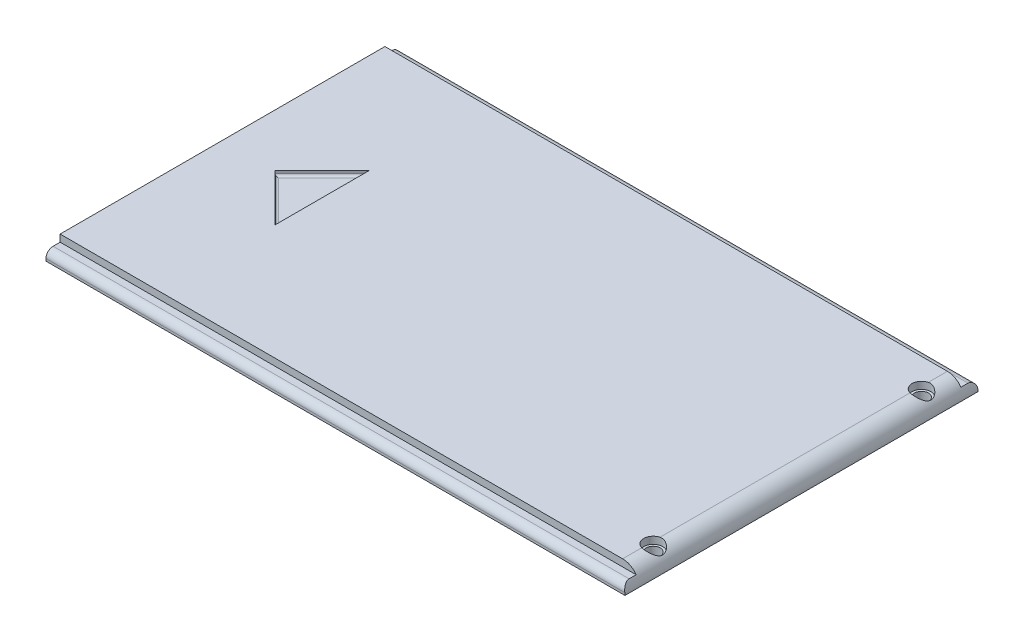
ISO-10303-21;
HEADER;
FILE_DESCRIPTION(('STEP AP214'),'2;1');
FILE_NAME('part.step','',(''),(''),'','','');
FILE_SCHEMA(('AUTOMOTIVE_DESIGN { 1 0 10303 214 1 1 1 1 }'));
ENDSEC;
DATA;
#1=APPLICATION_CONTEXT('core data for automotive mechanical design processes');
#2=APPLICATION_PROTOCOL_DEFINITION('international standard','automotive_design',2000,#1);
#3=PRODUCT_CONTEXT('',#1,'mechanical');
#4=PRODUCT('Part','Part','',(#3));
#5=PRODUCT_RELATED_PRODUCT_CATEGORY('part','',(#4));
#6=PRODUCT_DEFINITION_FORMATION('','',#4);
#7=PRODUCT_DEFINITION_CONTEXT('part definition',#1,'design');
#8=PRODUCT_DEFINITION('design','',#6,#7);
#9=PRODUCT_DEFINITION_SHAPE('','',#8);
#10=(LENGTH_UNIT() NAMED_UNIT(*) SI_UNIT(.MILLI.,.METRE.));
#11=(NAMED_UNIT(*) PLANE_ANGLE_UNIT() SI_UNIT($,.RADIAN.));
#12=(NAMED_UNIT(*) SI_UNIT($,.STERADIAN.) SOLID_ANGLE_UNIT());
#13=UNCERTAINTY_MEASURE_WITH_UNIT(LENGTH_MEASURE(1.E-05),#10,'distance_accuracy_value','');
#14=(GEOMETRIC_REPRESENTATION_CONTEXT(3) GLOBAL_UNCERTAINTY_ASSIGNED_CONTEXT((#13)) GLOBAL_UNIT_ASSIGNED_CONTEXT((#10,
#11,#12)) REPRESENTATION_CONTEXT('',''));
#15=CARTESIAN_POINT('',(0.,0.,0.));
#16=DIRECTION('',(0.,0.,1.));
#17=DIRECTION('',(1.,0.,0.));
#18=AXIS2_PLACEMENT_3D('',#15,#16,#17);
#19=CARTESIAN_POINT('',(64.50000001,-3.49999999,-37.5));
#20=DIRECTION('',(0.,0.,1.));
#21=DIRECTION('',(1.,0.,0.));
#22=AXIS2_PLACEMENT_3D('',#19,#20,#21);
#23=CYLINDRICAL_SURFACE('',#22,3.49999999);
#24=CARTESIAN_POINT('',(64.50000001,0.,30.4364916756857));
#25=CARTESIAN_POINT('',(64.5489479587532,8.99946474155549E-06,30.4491388532927));
#26=CARTESIAN_POINT('',(64.598379134142,-0.00102660867594324,30.4599135039343));
#27=CARTESIAN_POINT('',(64.6978167519258,-0.00524276917827934,30.4776821803047));
#28=CARTESIAN_POINT('',(64.7478230890506,-0.00842293497986771,30.4846768869653));
#29=CARTESIAN_POINT('',(64.8478154710043,-0.0169649068301376,30.4948321111438));
#30=CARTESIAN_POINT('',(64.8978006217056,-0.0223169719444363,30.498009500504));
#31=CARTESIAN_POINT('',(64.9975757498518,-0.0351833927190662,30.5006220024395));
#32=CARTESIAN_POINT('',(65.047365729486,-0.0426977240540573,30.5000571571131));
#33=CARTESIAN_POINT('',(65.1958748776527,-0.0684106047319932,30.492843890949));
#34=CARTESIAN_POINT('',(65.2938436313978,-0.0897884925022422,30.4806875611345));
#35=CARTESIAN_POINT('',(65.4850667284782,-0.140021107673576,30.442741894867));
#36=CARTESIAN_POINT('',(65.5783175771463,-0.168881283216222,30.4169426101623));
#37=CARTESIAN_POINT('',(65.7624589718375,-0.234090289111973,30.3516562499357));
#38=CARTESIAN_POINT('',(65.8530436176814,-0.27072253275191,30.311594119605));
#39=CARTESIAN_POINT('',(66.0258161552739,-0.34866883436279,30.2196784519949));
#40=CARTESIAN_POINT('',(66.1079986829417,-0.389985848127349,30.1678174493731));
#41=CARTESIAN_POINT('',(66.2755382638665,-0.48205578852724,30.0445008606348));
#42=CARTESIAN_POINT('',(66.3593168316978,-0.533263588531057,29.9712400835719));
#43=CARTESIAN_POINT('',(66.5136863511132,-0.635797683211848,29.811897125878));
#44=CARTESIAN_POINT('',(66.5842684723606,-0.687124034131373,29.7258064289061));
#45=CARTESIAN_POINT('',(66.704399132893,-0.780480331513154,29.5512098969664));
#46=CARTESIAN_POINT('',(66.7553795371559,-0.822920163852898,29.4639117918178));
#47=CARTESIAN_POINT('',(66.8444435150821,-0.900563181900162,29.2800131277751));
#48=CARTESIAN_POINT('',(66.8825507895468,-0.935779619147972,29.1834300894273));
#49=CARTESIAN_POINT('',(66.9368115889876,-0.987426766141093,29.0052914958963));
#50=CARTESIAN_POINT('',(66.9559982862572,-1.00631505933346,28.9253867690809));
#51=CARTESIAN_POINT('',(66.9844558796739,-1.03466157744723,28.7622330583456));
#52=CARTESIAN_POINT('',(66.9937411214326,-1.04413344389968,28.6789890945142));
#53=CARTESIAN_POINT('',(67.0017392496257,-1.05227847842123,28.5111073617221));
#54=CARTESIAN_POINT('',(67.000410096247,-1.05090870683998,28.4264653767825));
#55=CARTESIAN_POINT('',(66.9871925961815,-1.03749079231264,28.2588525666932));
#56=CARTESIAN_POINT('',(66.9752946032246,-1.02543289424369,28.1758833390492));
#57=CARTESIAN_POINT('',(66.9388159373426,-0.989436114341144,27.9995233220653));
#58=CARTESIAN_POINT('',(66.912365667948,-0.963774294191114,27.9068817081233));
#59=CARTESIAN_POINT('',(66.8477460989433,-0.903844576590191,27.7287284435997));
#60=CARTESIAN_POINT('',(66.8095524920008,-0.869558855709185,27.6432320540465));
#61=CARTESIAN_POINT('',(66.7092078774201,-0.784310374058825,27.4543550360266));
#62=CARTESIAN_POINT('',(66.6433000215003,-0.731494885936917,27.3538135636222));
#63=CARTESIAN_POINT('',(66.4955957207993,-0.623193590175312,27.166804750737));
#64=CARTESIAN_POINT('',(66.4137825505568,-0.567705018226645,27.0803524033506));
#65=CARTESIAN_POINT('',(66.2343509596974,-0.458090126062468,26.9217498933621));
#66=CARTESIAN_POINT('',(66.1365587851602,-0.403987346132609,26.8497789382701));
#67=CARTESIAN_POINT('',(65.9272118074362,-0.302102099808841,26.7237285203503));
#68=CARTESIAN_POINT('',(65.8156825209744,-0.254308246857113,26.6696165525979));
#69=CARTESIAN_POINT('',(65.6051824755106,-0.177583235053472,26.591159969809));
#70=CARTESIAN_POINT('',(65.5083098422401,-0.146793451130596,26.5629904081305));
#71=CARTESIAN_POINT('',(65.3092816539485,-0.0932981647452588,26.5214580014706));
#72=CARTESIAN_POINT('',(65.2071329242709,-0.0705825031444176,26.5080765045795));
#73=CARTESIAN_POINT('',(65.05378463043,-0.0437112266429289,26.5000908595401));
#74=CARTESIAN_POINT('',(65.0034410494837,-0.036022163592896,26.4993652628434));
#75=CARTESIAN_POINT('',(64.9025414196589,-0.02285431065166,26.5017398017844));
#76=CARTESIAN_POINT('',(64.8519853755725,-0.017375471175771,26.5048398515903));
#77=CARTESIAN_POINT('',(64.7508167322537,-0.00862784947519592,26.5149297670375));
#78=CARTESIAN_POINT('',(64.7002051126762,-0.00537024708748225,26.5219389916141));
#79=CARTESIAN_POINT('',(64.5995639613606,-0.00105137541180415,26.5398283267594));
#80=CARTESIAN_POINT('',(64.5495345624004,9.40227629696295E-06,26.5507093031006));
#81=CARTESIAN_POINT('',(64.50000001,0.,26.5635083243143));
#82=B_SPLINE_CURVE_WITH_KNOTS('',3,(#24,#25,#26,#27,#28,#29,#30,#31,#32,#33,#34,#35,#36,#37,#38,
#39,#40,#41,#42,#43,#44,#45,#46,#47,#48,#49,#50,#51,#52,#53,#54,#55,#56,#57,#58,#59,#60,#61,#62,
#63,#64,#65,#66,#67,#68,#69,#70,#71,#72,#73,#74,#75,#76,#77,#78,#79,#80,#81),.UNSPECIFIED.,.F.,
.F.,(4,2,2,2,2,2,2,2,2,2,2,2,2,2,2,2,2,2,2,2,2,2,2,2,2,2,2,2,4),(0.,0.151617585968135,
0.303207849918215,0.454125618392376,0.605041689118829,0.906544253342981,1.208266972787,
1.5238691431349,1.83967155830797,2.20576322191464,2.57209898400174,2.89988037826912,
3.227054960522,3.47900268804841,3.7305848859297,3.98316400340511,4.23597388913533,
4.53345697081039,4.8315600007783,5.22347686673843,5.61580810972407,6.01273052912397,
6.40892647878417,6.72407445087522,7.03882447744424,7.19146428222397,7.34410066245524,
7.49749972450405,7.65093311009855),.UNSPECIFIED.);
#83=CARTESIAN_POINT('',(64.50000001,0.,30.4364916756857));
#84=VERTEX_POINT('',#83);
#85=CARTESIAN_POINT('',(64.50000001,0.,26.5635083243143));
#86=VERTEX_POINT('',#85);
#87=EDGE_CURVE('E63',#84,#86,#82,.T.);
#88=ORIENTED_EDGE('',*,*,#87,.F.);
#89=DIRECTION('',(0.,0.,1.));
#90=VECTOR('',#89,1.);
#91=CARTESIAN_POINT('',(64.50000001,0.,0.));
#92=LINE('',#91,#90);
#93=CARTESIAN_POINT('',(64.50000001,0.,34.5));
#94=VERTEX_POINT('',#93);
#95=EDGE_CURVE('E176',#94,#84,#92,.F.);
#96=ORIENTED_EDGE('',*,*,#95,.F.);
#97=CARTESIAN_POINT('',(64.50000001,-3.49999999,34.5));
#98=DIRECTION('',(0.,0.,-1.));
#99=DIRECTION('',(-1.,0.,0.));
#100=AXIS2_PLACEMENT_3D('',#97,#98,#99);
#101=CIRCLE('',#100,3.49999999);
#102=CARTESIAN_POINT('',(67.3722813280467,-1.5,34.5));
#103=VERTEX_POINT('',#102);
#104=EDGE_CURVE('E181',#103,#94,#101,.F.);
#105=ORIENTED_EDGE('',*,*,#104,.F.);
#106=DIRECTION('',(0.,0.,1.));
#107=VECTOR('',#106,1.);
#108=CARTESIAN_POINT('',(67.3722813280467,-1.5,-37.5));
#109=LINE('',#108,#107);
#110=CARTESIAN_POINT('',(67.3722813280467,-1.5,36.));
#111=VERTEX_POINT('',#110);
#112=EDGE_CURVE('E328',#111,#103,#109,.F.);
#113=ORIENTED_EDGE('',*,*,#112,.F.);
#114=CARTESIAN_POINT('',(67.9641016164775,-3.,37.5));
#115=CARTESIAN_POINT('',(67.958056898597,-2.95809108313595,37.5000016562439));
#116=CARTESIAN_POINT('',(67.9512461853046,-2.91631921427232,37.4982428215695));
#117=CARTESIAN_POINT('',(67.9361821462669,-2.83334841832102,37.4912945517625));
#118=CARTESIAN_POINT('',(67.9279296528039,-2.79214917541149,37.4861070910567));
#119=CARTESIAN_POINT('',(67.9012324336867,-2.6702462904303,37.4656114921474));
#120=CARTESIAN_POINT('',(67.8807777568639,-2.59075851493561,37.4453679281022));
#121=CARTESIAN_POINT('',(67.8357522205007,-2.43738320617385,37.3928518395272));
#122=CARTESIAN_POINT('',(67.8111891992998,-2.36348539047602,37.3606020807296));
#123=CARTESIAN_POINT('',(67.7593563436892,-2.22240372235505,37.2852041133876));
#124=CARTESIAN_POINT('',(67.7320828798125,-2.15522912092652,37.2420411686738));
#125=CARTESIAN_POINT('',(67.6743936200363,-2.02393997257897,37.1422013803958));
#126=CARTESIAN_POINT('',(67.6438972838747,-1.96045569503672,37.084741746487));
#127=CARTESIAN_POINT('',(67.5840689082067,-1.84385389210013,36.9595047189957));
#128=CARTESIAN_POINT('',(67.5547376723847,-1.79074342691032,36.8917203540695));
#129=CARTESIAN_POINT('',(67.4988668899811,-1.69444839749928,36.7440522124822));
#130=CARTESIAN_POINT('',(67.4724833891901,-1.65173879962502,36.663796256405));
#131=CARTESIAN_POINT('',(67.4274148160973,-1.58114013996386,36.4951003823062));
#132=CARTESIAN_POINT('',(67.4087053801203,-1.5532040919889,36.4066874734797));
#133=CARTESIAN_POINT('',(67.3896524404958,-1.52515709307117,36.2765247768066));
#134=CARTESIAN_POINT('',(67.3849122713869,-1.51825306902602,36.2367771382134));
#135=CARTESIAN_POINT('',(67.3776047737033,-1.5076561641128,36.1566489817442));
#136=CARTESIAN_POINT('',(67.375037087309,-1.50396275443664,36.1162685692057));
#137=CARTESIAN_POINT('',(67.3721768855699,-1.49984759518409,36.0348859876478));
#138=CARTESIAN_POINT('',(67.371905761339,-1.49945660578885,35.9938815293493));
#139=CARTESIAN_POINT('',(67.3736848746566,-1.50202012500044,35.9120003721922));
#140=CARTESIAN_POINT('',(67.3757366670591,-1.50497687443005,35.8711237772936));
#141=CARTESIAN_POINT('',(67.3789451711659,-1.50960437882137,35.8305276058718));
#142=B_SPLINE_CURVE_WITH_KNOTS('',3,(#114,#115,#116,#117,#118,#119,#120,#121,#122,#123,#124,
#125,#126,#127,#128,#129,#130,#131,#132,#133,#134,#135,#136,#137,#138,#139,#140,#141),
.UNSPECIFIED.,.F.,.F.,(4,2,2,2,2,2,2,2,2,2,2,2,2,4),(0.,0.126935715191683,0.253798396121726,
0.506091616300996,0.757908863356798,1.01006797454409,1.28157490359765,1.55326597574902,
1.83568937731862,2.11720906634849,2.23891631717456,2.36060351826163,2.48342293122763,
2.60632460249966),.UNSPECIFIED.);
#143=CARTESIAN_POINT('',(67.9641016164775,-3.,37.5));
#144=VERTEX_POINT('',#143);
#145=EDGE_CURVE('E214',#144,#111,#142,.T.);
#146=ORIENTED_EDGE('',*,*,#145,.F.);
#147=CARTESIAN_POINT('',(64.50000001,-3.49999999,37.5));
#148=DIRECTION('',(0.,0.,1.));
#149=DIRECTION('',(1.,0.,0.));
#150=AXIS2_PLACEMENT_3D('',#147,#148,#149);
#151=CIRCLE('',#150,3.49999999);
#152=CARTESIAN_POINT('',(68.,-3.5,37.5));
#153=VERTEX_POINT('',#152);
#154=EDGE_CURVE('E324',#153,#144,#151,.T.);
#155=ORIENTED_EDGE('',*,*,#154,.F.);
#156=DIRECTION('',(0.,0.,-1.));
#157=VECTOR('',#156,1.);
#158=CARTESIAN_POINT('',(68.,-3.5,-37.5));
#159=LINE('',#158,#157);
#160=CARTESIAN_POINT('',(68.,-3.5,-37.5));
#161=VERTEX_POINT('',#160);
#162=EDGE_CURVE('E366',#153,#161,#159,.T.);
#163=ORIENTED_EDGE('',*,*,#162,.T.);
#164=CARTESIAN_POINT('',(64.50000001,-3.49999999,-37.5));
#165=DIRECTION('',(0.,0.,-1.));
#166=DIRECTION('',(-1.,0.,0.));
#167=AXIS2_PLACEMENT_3D('',#164,#165,#166);
#168=CIRCLE('',#167,3.49999999);
#169=CARTESIAN_POINT('',(67.9641016164775,-3.,-37.5));
#170=VERTEX_POINT('',#169);
#171=EDGE_CURVE('E202',#170,#161,#168,.T.);
#172=ORIENTED_EDGE('',*,*,#171,.F.);
#173=CARTESIAN_POINT('',(67.3722813280467,-1.5,-36.));
#174=CARTESIAN_POINT('',(67.3722733039118,-1.49999626556642,-36.0380156616939));
#175=CARTESIAN_POINT('',(67.3732887534835,-1.5014461768493,-36.0760086821842));
#176=CARTESIAN_POINT('',(67.3772874676731,-1.50720402057786,-36.1516453567383));
#177=CARTESIAN_POINT('',(67.3802692551257,-1.51150980762779,-36.1892892515647));
#178=CARTESIAN_POINT('',(67.3919864263606,-1.52855098704535,-36.3007421376261));
#179=CARTESIAN_POINT('',(67.4034961779184,-1.54541199213621,-36.3736763704343));
#180=CARTESIAN_POINT('',(67.4324904153631,-1.58919531576038,-36.5148756346789));
#181=CARTESIAN_POINT('',(67.4499592261555,-1.6160912549799,-36.583152357766));
#182=CARTESIAN_POINT('',(67.489162834911,-1.67893516282104,-36.714197995986));
#183=CARTESIAN_POINT('',(67.5109054964191,-1.71489985224839,-36.7769564451374));
#184=CARTESIAN_POINT('',(67.5592426880696,-1.79893867661959,-36.9020473801628));
#185=CARTESIAN_POINT('',(67.586105333043,-1.84786766604753,-36.9637002131724));
#186=CARTESIAN_POINT('',(67.6408462014888,-1.9544652647839,-37.0784210994685));
#187=CARTESIAN_POINT('',(67.6687249350644,-2.01213831105433,-37.1314847659625));
#188=CARTESIAN_POINT('',(67.7272676525446,-2.14333087993751,-37.2344845173913));
#189=CARTESIAN_POINT('',(67.7578205252307,-2.21793614665789,-37.2831095042347));
#190=CARTESIAN_POINT('',(67.8155270933459,-2.37559315090751,-37.3667660070858));
#191=CARTESIAN_POINT('',(67.8426849020325,-2.45863444223871,-37.4018140823224));
#192=CARTESIAN_POINT('',(67.8789851202846,-2.58656545593647,-37.4425679379369));
#193=CARTESIAN_POINT('',(67.8902046145112,-2.62908852817546,-37.4540907878974));
#194=CARTESIAN_POINT('',(67.9111964493971,-2.715331927503,-37.473402245736));
#195=CARTESIAN_POINT('',(67.9209690183686,-2.75905206441233,-37.481191443187));
#196=CARTESIAN_POINT('',(67.938952222047,-2.84757768929266,-37.4929067216173));
#197=CARTESIAN_POINT('',(67.9471540290881,-2.89238780288816,-37.4968114584446));
#198=CARTESIAN_POINT('',(67.9618328917031,-2.98249007145641,-37.5005781500199));
#199=CARTESIAN_POINT('',(67.9683086916441,-3.02778255256649,-37.5004371696538));
#200=CARTESIAN_POINT('',(67.9738673480328,-3.07309760332455,-37.4982178547822));
#201=B_SPLINE_CURVE_WITH_KNOTS('',3,(#173,#174,#175,#176,#177,#178,#179,#180,#181,#182,#183,
#184,#185,#186,#187,#188,#189,#190,#191,#192,#193,#194,#195,#196,#197,#198,#199,#200),
.UNSPECIFIED.,.F.,.F.,(4,2,2,2,2,2,2,2,2,2,2,2,2,4),(0.,0.11396307743252,0.227840640149945,
0.453810611461328,0.679190702585812,0.904989423642965,1.15353224368668,1.40220160554837,
1.68331149614383,1.96407744030279,2.10030771808101,2.23651647694389,2.37346960241248,
2.51052208806994),.UNSPECIFIED.);
#202=CARTESIAN_POINT('',(67.3722813280467,-1.5,-36.));
#203=VERTEX_POINT('',#202);
#204=EDGE_CURVE('E192',#203,#170,#201,.T.);
#205=ORIENTED_EDGE('',*,*,#204,.F.);
#206=DIRECTION('',(0.,0.,1.));
#207=VECTOR('',#206,1.);
#208=CARTESIAN_POINT('',(67.3722813280467,-1.5,-37.5));
#209=LINE('',#208,#207);
#210=CARTESIAN_POINT('',(67.3722813280467,-1.5,-34.5));
#211=VERTEX_POINT('',#210);
#212=EDGE_CURVE('E188',#211,#203,#209,.F.);
#213=ORIENTED_EDGE('',*,*,#212,.F.);
#214=CARTESIAN_POINT('',(64.50000001,-3.49999999,-34.5));
#215=DIRECTION('',(0.,0.,1.));
#216=DIRECTION('',(1.,0.,0.));
#217=AXIS2_PLACEMENT_3D('',#214,#215,#216);
#218=CIRCLE('',#217,3.49999999);
#219=CARTESIAN_POINT('',(64.50000001,0.,-34.5));
#220=VERTEX_POINT('',#219);
#221=EDGE_CURVE('E180',#220,#211,#218,.F.);
#222=ORIENTED_EDGE('',*,*,#221,.F.);
#223=CARTESIAN_POINT('',(64.50000001,0.,-30.4364916756857));
#224=VERTEX_POINT('',#223);
#225=EDGE_CURVE('E167',#224,#220,#92,.F.);
#226=ORIENTED_EDGE('',*,*,#225,.F.);
#227=CARTESIAN_POINT('',(64.50000001,0.,-26.5635083243143));
#228=CARTESIAN_POINT('',(64.5489479587532,8.9994647417253E-06,-26.5508611467073));
#229=CARTESIAN_POINT('',(64.598379134142,-0.00102660867594314,-26.5400864960657));
#230=CARTESIAN_POINT('',(64.6978167519258,-0.00524276917827942,-26.5223178196953));
#231=CARTESIAN_POINT('',(64.7478230890506,-0.00842293497986787,-26.5153231130347));
#232=CARTESIAN_POINT('',(64.8478154710043,-0.0169649068301375,-26.5051678888563));
#233=CARTESIAN_POINT('',(64.8978006217056,-0.022316971944436,-26.501990499496));
#234=CARTESIAN_POINT('',(64.9975757498518,-0.0351833927190659,-26.4993779975605));
#235=CARTESIAN_POINT('',(65.047365729486,-0.0426977240540573,-26.4999428428869));
#236=CARTESIAN_POINT('',(65.1958748776527,-0.0684106047319937,-26.507156109051));
#237=CARTESIAN_POINT('',(65.2938436313978,-0.0897884925022425,-26.5193124388655));
#238=CARTESIAN_POINT('',(65.4850667284782,-0.140021107673576,-26.557258105133));
#239=CARTESIAN_POINT('',(65.5783175771463,-0.168881283216222,-26.5830573898377));
#240=CARTESIAN_POINT('',(65.7624589718375,-0.234090289111973,-26.6483437500643));
#241=CARTESIAN_POINT('',(65.8530436176814,-0.27072253275191,-26.688405880395));
#242=CARTESIAN_POINT('',(66.0258161552739,-0.34866883436279,-26.7803215480051));
#243=CARTESIAN_POINT('',(66.1079986829417,-0.389985848127349,-26.8321825506269));
#244=CARTESIAN_POINT('',(66.2755382638665,-0.482055788527239,-26.9554991393652));
#245=CARTESIAN_POINT('',(66.3593168316978,-0.533263588531057,-27.0287599164281));
#246=CARTESIAN_POINT('',(66.5136863511132,-0.635797683211848,-27.188102874122));
#247=CARTESIAN_POINT('',(66.5842684723606,-0.687124034131373,-27.2741935710939));
#248=CARTESIAN_POINT('',(66.704399132893,-0.780480331513154,-27.4487901030336));
#249=CARTESIAN_POINT('',(66.7553795371559,-0.822920163852898,-27.5360882081822));
#250=CARTESIAN_POINT('',(66.8444435150821,-0.900563181900162,-27.7199868722249));
#251=CARTESIAN_POINT('',(66.8825507895468,-0.935779619147972,-27.8165699105728));
#252=CARTESIAN_POINT('',(66.9368115889876,-0.987426766141094,-27.9947085041037));
#253=CARTESIAN_POINT('',(66.9559982862572,-1.00631505933346,-28.0746132309191));
#254=CARTESIAN_POINT('',(66.9844558796739,-1.03466157744724,-28.2377669416544));
#255=CARTESIAN_POINT('',(66.9937411214326,-1.04413344389968,-28.3210109054858));
#256=CARTESIAN_POINT('',(67.0017392496257,-1.05227847842123,-28.4888926382779));
#257=CARTESIAN_POINT('',(67.000410096247,-1.05090870683998,-28.5735346232175));
#258=CARTESIAN_POINT('',(66.9871925961815,-1.03749079231264,-28.7411474333068));
#259=CARTESIAN_POINT('',(66.9752946032246,-1.02543289424369,-28.8241166609508));
#260=CARTESIAN_POINT('',(66.9388159373426,-0.989436114341142,-29.0004766779347));
#261=CARTESIAN_POINT('',(66.912365667948,-0.963774294191111,-29.0931182918767));
#262=CARTESIAN_POINT('',(66.8477460989433,-0.903844576590188,-29.2712715564003));
#263=CARTESIAN_POINT('',(66.8095524920008,-0.869558855709182,-29.3567679459535));
#264=CARTESIAN_POINT('',(66.7092078774201,-0.784310374058823,-29.5456449639734));
#265=CARTESIAN_POINT('',(66.6433000215003,-0.731494885936915,-29.6461864363778));
#266=CARTESIAN_POINT('',(66.4955957207993,-0.623193590175311,-29.833195249263));
#267=CARTESIAN_POINT('',(66.4137825505568,-0.567705018226644,-29.9196475966494));
#268=CARTESIAN_POINT('',(66.2343509596974,-0.458090126062468,-30.0782501066379));
#269=CARTESIAN_POINT('',(66.1365587851602,-0.403987346132609,-30.1502210617299));
#270=CARTESIAN_POINT('',(65.9272118074362,-0.30210209980884,-30.2762714796497));
#271=CARTESIAN_POINT('',(65.8156825209744,-0.254308246857112,-30.3303834474021));
#272=CARTESIAN_POINT('',(65.6051824755106,-0.177583235053471,-30.408840030191));
#273=CARTESIAN_POINT('',(65.5083098422401,-0.146793451130596,-30.4370095918695));
#274=CARTESIAN_POINT('',(65.3092816539485,-0.0932981647452589,-30.4785419985294));
#275=CARTESIAN_POINT('',(65.2071329242709,-0.070582503144418,-30.4919234954205));
#276=CARTESIAN_POINT('',(65.05378463043,-0.0437112266429289,-30.4999091404599));
#277=CARTESIAN_POINT('',(65.0034410494837,-0.0360221635928958,-30.5006347371566));
#278=CARTESIAN_POINT('',(64.9025414196589,-0.02285431065166,-30.4982601982156));
#279=CARTESIAN_POINT('',(64.8519853755725,-0.0173754711757714,-30.4951601484097));
#280=CARTESIAN_POINT('',(64.7508167322537,-0.00862784947519637,-30.4850702329625));
#281=CARTESIAN_POINT('',(64.7002051126762,-0.00537024708748239,-30.4780610083859));
#282=CARTESIAN_POINT('',(64.5995639613606,-0.00105137541180388,-30.4601716732406));
#283=CARTESIAN_POINT('',(64.5495345624004,9.40227629734599E-06,-30.4492906968994));
#284=CARTESIAN_POINT('',(64.50000001,0.,-30.4364916756857));
#285=B_SPLINE_CURVE_WITH_KNOTS('',3,(#227,#228,#229,#230,#231,#232,#233,#234,#235,#236,#237,
#238,#239,#240,#241,#242,#243,#244,#245,#246,#247,#248,#249,#250,#251,#252,#253,#254,#255,#256,
#257,#258,#259,#260,#261,#262,#263,#264,#265,#266,#267,#268,#269,#270,#271,#272,#273,#274,#275,
#276,#277,#278,#279,#280,#281,#282,#283,#284),.UNSPECIFIED.,.F.,.F.,(4,2,2,2,2,2,2,2,2,2,2,2,2,
2,2,2,2,2,2,2,2,2,2,2,2,2,2,2,4),(0.,0.151617585968137,0.303207849918216,0.454125618392377,
0.605041689118831,0.906544253342982,1.208266972787,1.5238691431349,1.83967155830797,
2.20576322191464,2.57209898400174,2.89988037826912,3.227054960522,3.47900268804841,
3.7305848859297,3.98316400340512,4.23597388913534,4.5334569708104,4.83156000077831,
5.22347686673843,5.61580810972407,6.01273052912397,6.40892647878417,6.72407445087522,
7.03882447744424,7.19146428222397,7.34410066245524,7.49749972450405,7.65093311009855),.UNSPECIFIED.);
#286=CARTESIAN_POINT('',(64.50000001,0.,-26.5635083243143));
#287=VERTEX_POINT('',#286);
#288=EDGE_CURVE('E56',#287,#224,#285,.T.);
#289=ORIENTED_EDGE('',*,*,#288,.F.);
#290=EDGE_CURVE('E165',#86,#287,#92,.F.);
#291=ORIENTED_EDGE('',*,*,#290,.F.);
#292=EDGE_LOOP('',(#88,#96,#105,#113,#146,#155,#163,#172,#205,#213,#222,#226,#289,#291));
#293=FACE_BOUND('',#292,.T.);
#294=ADVANCED_FACE('F39',(#293),#23,.T.);
#295=CARTESIAN_POINT('',(0.,-3.,-36.));
#296=DIRECTION('',(-1.,0.,0.));
#297=DIRECTION('',(0.,0.,1.));
#298=AXIS2_PLACEMENT_3D('',#295,#296,#297);
#299=CYLINDRICAL_SURFACE('',#298,1.5);
#300=DIRECTION('',(-1.,0.,0.));
#301=VECTOR('',#300,1.);
#302=CARTESIAN_POINT('',(0.,-1.5,-36.));
#303=LINE('',#302,#301);
#304=CARTESIAN_POINT('',(-55.,-1.5,-36.));
#305=VERTEX_POINT('',#304);
#306=EDGE_CURVE('E310',#203,#305,#303,.T.);
#307=ORIENTED_EDGE('',*,*,#306,.F.);
#308=ORIENTED_EDGE('',*,*,#204,.T.);
#309=DIRECTION('',(-1.,0.,0.));
#310=VECTOR('',#309,1.);
#311=CARTESIAN_POINT('',(-55.,-3.,-37.5));
#312=LINE('',#311,#310);
#313=CARTESIAN_POINT('',(-55.,-3.,-37.5));
#314=VERTEX_POINT('',#313);
#315=EDGE_CURVE('E318',#314,#170,#312,.F.);
#316=ORIENTED_EDGE('',*,*,#315,.F.);
#317=CARTESIAN_POINT('',(-55.,-3.,-36.));
#318=DIRECTION('',(-1.,0.,0.));
#319=DIRECTION('',(0.,0.,1.));
#320=AXIS2_PLACEMENT_3D('',#317,#318,#319);
#321=CIRCLE('',#320,1.5);
#322=EDGE_CURVE('E322',#305,#314,#321,.T.);
#323=ORIENTED_EDGE('',*,*,#322,.F.);
#324=EDGE_LOOP('',(#307,#308,#316,#323));
#325=FACE_BOUND('',#324,.T.);
#326=ADVANCED_FACE('F204',(#325),#299,.T.);
#327=CARTESIAN_POINT('',(0.,-3.,36.));
#328=DIRECTION('',(-1.,0.,0.));
#329=DIRECTION('',(0.,0.,1.));
#330=AXIS2_PLACEMENT_3D('',#327,#328,#329);
#331=CYLINDRICAL_SURFACE('',#330,1.5);
#332=DIRECTION('',(1.,0.,0.));
#333=VECTOR('',#332,1.);
#334=CARTESIAN_POINT('',(0.,-3.,37.5));
#335=LINE('',#334,#333);
#336=CARTESIAN_POINT('',(-55.,-3.,37.5));
#337=VERTEX_POINT('',#336);
#338=EDGE_CURVE('E299',#144,#337,#335,.F.);
#339=ORIENTED_EDGE('',*,*,#338,.F.);
#340=ORIENTED_EDGE('',*,*,#145,.T.);
#341=DIRECTION('',(1.,0.,0.));
#342=VECTOR('',#341,1.);
#343=CARTESIAN_POINT('',(0.,-1.5,36.));
#344=LINE('',#343,#342);
#345=CARTESIAN_POINT('',(-55.,-1.5,36.));
#346=VERTEX_POINT('',#345);
#347=EDGE_CURVE('E306',#346,#111,#344,.T.);
#348=ORIENTED_EDGE('',*,*,#347,.F.);
#349=CARTESIAN_POINT('',(-55.,-3.,36.));
#350=DIRECTION('',(-1.,0.,0.));
#351=DIRECTION('',(0.,0.,1.));
#352=AXIS2_PLACEMENT_3D('',#349,#350,#351);
#353=CIRCLE('',#352,1.5);
#354=EDGE_CURVE('E302',#337,#346,#353,.T.);
#355=ORIENTED_EDGE('',*,*,#354,.F.);
#356=EDGE_LOOP('',(#339,#340,#348,#355));
#357=FACE_BOUND('',#356,.T.);
#358=ADVANCED_FACE('F282',(#357),#331,.T.);
#359=CARTESIAN_POINT('',(-55.,-3.5,-37.5));
#360=DIRECTION('',(0.,0.,-1.));
#361=DIRECTION('',(-1.,0.,0.));
#362=AXIS2_PLACEMENT_3D('',#359,#360,#361);
#363=PLANE('',#362);
#364=ORIENTED_EDGE('',*,*,#315,.T.);
#365=ORIENTED_EDGE('',*,*,#171,.T.);
#366=DIRECTION('',(-1.,0.,0.));
#367=VECTOR('',#366,1.);
#368=CARTESIAN_POINT('',(-55.,-3.5,-37.5));
#369=LINE('',#368,#367);
#370=CARTESIAN_POINT('',(-55.,-3.5,-37.5));
#371=VERTEX_POINT('',#370);
#372=EDGE_CURVE('E370',#161,#371,#369,.T.);
#373=ORIENTED_EDGE('',*,*,#372,.T.);
#374=DIRECTION('',(0.,1.,0.));
#375=VECTOR('',#374,1.);
#376=CARTESIAN_POINT('',(-55.,-3.5,-37.5));
#377=LINE('',#376,#375);
#378=EDGE_CURVE('E312',#371,#314,#377,.T.);
#379=ORIENTED_EDGE('',*,*,#378,.T.);
#380=EDGE_LOOP('',(#364,#365,#373,#379));
#381=FACE_BOUND('',#380,.T.);
#382=ADVANCED_FACE('F278',(#381),#363,.T.);
#383=CARTESIAN_POINT('',(-55.,-3.5,-37.5));
#384=DIRECTION('',(-1.,0.,0.));
#385=DIRECTION('',(0.,0.,1.));
#386=AXIS2_PLACEMENT_3D('',#383,#384,#385);
#387=PLANE('',#386);
#388=DIRECTION('',(0.,0.,1.));
#389=VECTOR('',#388,1.);
#390=CARTESIAN_POINT('',(-55.,-1.5,-37.5));
#391=LINE('',#390,#389);
#392=CARTESIAN_POINT('',(-55.,-1.5,-34.5));
#393=VERTEX_POINT('',#392);
#394=EDGE_CURVE('E394',#305,#393,#391,.T.);
#395=ORIENTED_EDGE('',*,*,#394,.F.);
#396=ORIENTED_EDGE('',*,*,#322,.T.);
#397=ORIENTED_EDGE('',*,*,#378,.F.);
#398=DIRECTION('',(0.,0.,1.));
#399=VECTOR('',#398,1.);
#400=CARTESIAN_POINT('',(-55.,-3.5,-37.5));
#401=LINE('',#400,#399);
#402=CARTESIAN_POINT('',(-55.,-3.5,37.5));
#403=VERTEX_POINT('',#402);
#404=EDGE_CURVE('E359',#371,#403,#401,.T.);
#405=ORIENTED_EDGE('',*,*,#404,.T.);
#406=DIRECTION('',(0.,1.,0.));
#407=VECTOR('',#406,1.);
#408=CARTESIAN_POINT('',(-55.,-3.5,37.5));
#409=LINE('',#408,#407);
#410=EDGE_CURVE('E374',#403,#337,#409,.T.);
#411=ORIENTED_EDGE('',*,*,#410,.T.);
#412=ORIENTED_EDGE('',*,*,#354,.T.);
#413=DIRECTION('',(0.,0.,1.));
#414=VECTOR('',#413,1.);
#415=CARTESIAN_POINT('',(-55.,-1.5,37.5));
#416=LINE('',#415,#414);
#417=CARTESIAN_POINT('',(-55.,-1.5,34.5));
#418=VERTEX_POINT('',#417);
#419=EDGE_CURVE('E344',#418,#346,#416,.T.);
#420=ORIENTED_EDGE('',*,*,#419,.F.);
#421=DIRECTION('',(0.,1.,0.));
#422=VECTOR('',#421,1.);
#423=CARTESIAN_POINT('',(-55.,-1.5,34.5));
#424=LINE('',#423,#422);
#425=CARTESIAN_POINT('',(-55.,0.,34.5));
#426=VERTEX_POINT('',#425);
#427=EDGE_CURVE('E355',#418,#426,#424,.T.);
#428=ORIENTED_EDGE('',*,*,#427,.T.);
#429=DIRECTION('',(0.,0.,1.));
#430=VECTOR('',#429,1.);
#431=CARTESIAN_POINT('',(-55.,0.,-37.5));
#432=LINE('',#431,#430);
#433=CARTESIAN_POINT('',(-55.,0.,-34.5));
#434=VERTEX_POINT('',#433);
#435=EDGE_CURVE('E342',#434,#426,#432,.T.);
#436=ORIENTED_EDGE('',*,*,#435,.F.);
#437=DIRECTION('',(0.,1.,0.));
#438=VECTOR('',#437,1.);
#439=CARTESIAN_POINT('',(-55.,-1.5,-34.5));
#440=LINE('',#439,#438);
#441=EDGE_CURVE('E377',#393,#434,#440,.T.);
#442=ORIENTED_EDGE('',*,*,#441,.F.);
#443=EDGE_LOOP('',(#395,#396,#397,#405,#411,#412,#420,#428,#436,#442));
#444=FACE_BOUND('',#443,.T.);
#445=ADVANCED_FACE('F281',(#444),#387,.T.);
#446=CARTESIAN_POINT('',(-55.,-3.5,37.5));
#447=DIRECTION('',(0.,0.,1.));
#448=DIRECTION('',(1.,0.,0.));
#449=AXIS2_PLACEMENT_3D('',#446,#447,#448);
#450=PLANE('',#449);
#451=DIRECTION('',(1.,0.,0.));
#452=VECTOR('',#451,1.);
#453=CARTESIAN_POINT('',(-55.,-3.5,37.5));
#454=LINE('',#453,#452);
#455=EDGE_CURVE('E363',#403,#153,#454,.T.);
#456=ORIENTED_EDGE('',*,*,#455,.T.);
#457=ORIENTED_EDGE('',*,*,#154,.T.);
#458=ORIENTED_EDGE('',*,*,#338,.T.);
#459=ORIENTED_EDGE('',*,*,#410,.F.);
#460=EDGE_LOOP('',(#456,#457,#458,#459));
#461=FACE_BOUND('',#460,.T.);
#462=ADVANCED_FACE('F274',(#461),#450,.T.);
#463=CARTESIAN_POINT('',(0.,-3.5,0.));
#464=DIRECTION('',(0.,1.,0.));
#465=DIRECTION('',(0.,0.,1.));
#466=AXIS2_PLACEMENT_3D('',#463,#464,#465);
#467=PLANE('',#466);
#468=CARTESIAN_POINT('',(65.,-3.5,-28.5));
#469=DIRECTION('',(0.,1.,0.));
#470=DIRECTION('',(0.,0.,1.));
#471=AXIS2_PLACEMENT_3D('',#468,#469,#470);
#472=CIRCLE('',#471,1.5);
#473=CARTESIAN_POINT('',(65.,-3.5,-27.));
#474=VERTEX_POINT('',#473);
#475=EDGE_CURVE('E443',#474,#474,#472,.T.);
#476=ORIENTED_EDGE('',*,*,#475,.T.);
#477=EDGE_LOOP('',(#476));
#478=FACE_BOUND('',#477,.T.);
#479=CARTESIAN_POINT('',(65.,-3.5,28.5));
#480=DIRECTION('',(0.,1.,0.));
#481=DIRECTION('',(0.,0.,1.));
#482=AXIS2_PLACEMENT_3D('',#479,#480,#481);
#483=CIRCLE('',#482,1.5);
#484=CARTESIAN_POINT('',(65.,-3.5,30.));
#485=VERTEX_POINT('',#484);
#486=EDGE_CURVE('E450',#485,#485,#483,.T.);
#487=ORIENTED_EDGE('',*,*,#486,.T.);
#488=EDGE_LOOP('',(#487));
#489=FACE_BOUND('',#488,.T.);
#490=ORIENTED_EDGE('',*,*,#404,.F.);
#491=ORIENTED_EDGE('',*,*,#372,.F.);
#492=ORIENTED_EDGE('',*,*,#162,.F.);
#493=ORIENTED_EDGE('',*,*,#455,.F.);
#494=EDGE_LOOP('',(#490,#491,#492,#493));
#495=FACE_BOUND('',#494,.T.);
#496=ADVANCED_FACE('F271',(#478,#489,#495),#467,.F.);
#497=CARTESIAN_POINT('',(0.,0.,0.));
#498=DIRECTION('',(0.,1.,0.));
#499=DIRECTION('',(0.,0.,1.));
#500=AXIS2_PLACEMENT_3D('',#497,#498,#499);
#501=PLANE('',#500);
#502=CARTESIAN_POINT('',(65.,0.,28.5));
#503=DIRECTION('',(0.,1.,0.));
#504=DIRECTION('',(0.,0.,1.));
#505=AXIS2_PLACEMENT_3D('',#502,#503,#504);
#506=CIRCLE('',#505,2.);
#507=EDGE_CURVE('E174',#86,#84,#506,.T.);
#508=ORIENTED_EDGE('',*,*,#507,.F.);
#509=ORIENTED_EDGE('',*,*,#290,.T.);
#510=CARTESIAN_POINT('',(65.,0.,-28.5));
#511=DIRECTION('',(0.,1.,0.));
#512=DIRECTION('',(0.,0.,1.));
#513=AXIS2_PLACEMENT_3D('',#510,#511,#512);
#514=CIRCLE('',#513,2.);
#515=EDGE_CURVE('E154',#224,#287,#514,.T.);
#516=ORIENTED_EDGE('',*,*,#515,.F.);
#517=ORIENTED_EDGE('',*,*,#225,.T.);
#518=DIRECTION('',(1.,0.,0.));
#519=VECTOR('',#518,1.);
#520=CARTESIAN_POINT('',(-55.,0.,-34.5));
#521=LINE('',#520,#519);
#522=EDGE_CURVE('E358',#434,#220,#521,.T.);
#523=ORIENTED_EDGE('',*,*,#522,.F.);
#524=ORIENTED_EDGE('',*,*,#435,.T.);
#525=DIRECTION('',(-1.,0.,0.));
#526=VECTOR('',#525,1.);
#527=CARTESIAN_POINT('',(-55.,0.,34.5));
#528=LINE('',#527,#526);
#529=EDGE_CURVE('E336',#94,#426,#528,.T.);
#530=ORIENTED_EDGE('',*,*,#529,.F.);
#531=ORIENTED_EDGE('',*,*,#95,.T.);
#532=EDGE_LOOP('',(#508,#509,#516,#517,#523,#524,#530,#531));
#533=FACE_BOUND('',#532,.T.);
#534=DIRECTION('',(-0.707106781186548,0.,0.707106781186547));
#535=VECTOR('',#534,1.);
#536=CARTESIAN_POINT('',(-33.8527430622121,0.,-10.));
#537=LINE('',#536,#535);
#538=CARTESIAN_POINT('',(-33.8527430622121,0.,-10.));
#539=VERTEX_POINT('',#538);
#540=CARTESIAN_POINT('',(-43.8527430622121,0.,0.));
#541=VERTEX_POINT('',#540);
#542=EDGE_CURVE('E421',#539,#541,#537,.T.);
#543=ORIENTED_EDGE('',*,*,#542,.F.);
#544=DIRECTION('',(0.,0.,-1.));
#545=VECTOR('',#544,1.);
#546=CARTESIAN_POINT('',(-33.8527430622121,0.,10.));
#547=LINE('',#546,#545);
#548=CARTESIAN_POINT('',(-33.8527430622121,0.,10.));
#549=VERTEX_POINT('',#548);
#550=EDGE_CURVE('E412',#549,#539,#547,.T.);
#551=ORIENTED_EDGE('',*,*,#550,.F.);
#552=DIRECTION('',(0.707106781186548,0.,0.707106781186547));
#553=VECTOR('',#552,1.);
#554=CARTESIAN_POINT('',(-43.8527430622121,0.,0.));
#555=LINE('',#554,#553);
#556=EDGE_CURVE('E418',#541,#549,#555,.T.);
#557=ORIENTED_EDGE('',*,*,#556,.F.);
#558=EDGE_LOOP('',(#543,#551,#557));
#559=FACE_BOUND('',#558,.T.);
#560=ADVANCED_FACE('F171',(#533,#559),#501,.T.);
#561=CARTESIAN_POINT('',(-55.,-1.5,34.5));
#562=DIRECTION('',(0.,0.,-1.));
#563=DIRECTION('',(-1.,0.,0.));
#564=AXIS2_PLACEMENT_3D('',#561,#562,#563);
#565=PLANE('',#564);
#566=DIRECTION('',(-1.,0.,0.));
#567=VECTOR('',#566,1.);
#568=CARTESIAN_POINT('',(-55.,-1.5,34.5));
#569=LINE('',#568,#567);
#570=EDGE_CURVE('E338',#103,#418,#569,.T.);
#571=ORIENTED_EDGE('',*,*,#570,.F.);
#572=ORIENTED_EDGE('',*,*,#104,.T.);
#573=ORIENTED_EDGE('',*,*,#529,.T.);
#574=ORIENTED_EDGE('',*,*,#427,.F.);
#575=EDGE_LOOP('',(#571,#572,#573,#574));
#576=FACE_BOUND('',#575,.T.);
#577=ADVANCED_FACE('F266',(#576),#565,.F.);
#578=CARTESIAN_POINT('',(0.,-1.5,0.));
#579=DIRECTION('',(0.,-1.,0.));
#580=DIRECTION('',(0.,0.,-1.));
#581=AXIS2_PLACEMENT_3D('',#578,#579,#580);
#582=PLANE('',#581);
#583=ORIENTED_EDGE('',*,*,#347,.T.);
#584=ORIENTED_EDGE('',*,*,#112,.T.);
#585=ORIENTED_EDGE('',*,*,#570,.T.);
#586=ORIENTED_EDGE('',*,*,#419,.T.);
#587=EDGE_LOOP('',(#583,#584,#585,#586));
#588=FACE_BOUND('',#587,.T.);
#589=ADVANCED_FACE('F262',(#588),#582,.F.);
#590=CARTESIAN_POINT('',(-55.,-1.5,-34.5));
#591=DIRECTION('',(0.,0.,1.));
#592=DIRECTION('',(1.,0.,0.));
#593=AXIS2_PLACEMENT_3D('',#590,#591,#592);
#594=PLANE('',#593);
#595=ORIENTED_EDGE('',*,*,#522,.T.);
#596=ORIENTED_EDGE('',*,*,#221,.T.);
#597=DIRECTION('',(1.,0.,0.));
#598=VECTOR('',#597,1.);
#599=CARTESIAN_POINT('',(-55.,-1.5,-34.5));
#600=LINE('',#599,#598);
#601=EDGE_CURVE('E398',#393,#211,#600,.T.);
#602=ORIENTED_EDGE('',*,*,#601,.F.);
#603=ORIENTED_EDGE('',*,*,#441,.T.);
#604=EDGE_LOOP('',(#595,#596,#602,#603));
#605=FACE_BOUND('',#604,.T.);
#606=ADVANCED_FACE('F258',(#605),#594,.F.);
#607=CARTESIAN_POINT('',(0.,-1.5,0.));
#608=DIRECTION('',(0.,1.,0.));
#609=DIRECTION('',(0.,0.,1.));
#610=AXIS2_PLACEMENT_3D('',#607,#608,#609);
#611=PLANE('',#610);
#612=ORIENTED_EDGE('',*,*,#601,.T.);
#613=ORIENTED_EDGE('',*,*,#212,.T.);
#614=ORIENTED_EDGE('',*,*,#306,.T.);
#615=ORIENTED_EDGE('',*,*,#394,.T.);
#616=EDGE_LOOP('',(#612,#613,#614,#615));
#617=FACE_BOUND('',#616,.T.);
#618=ADVANCED_FACE('F254',(#617),#611,.T.);
#619=CARTESIAN_POINT('',(-33.8527430622121,-1.,-10.));
#620=DIRECTION('',(-0.707106781186547,0.,-0.707106781186548));
#621=DIRECTION('',(-0.707106781186548,0.,0.707106781186547));
#622=AXIS2_PLACEMENT_3D('',#619,#620,#621);
#623=PLANE('',#622);
#624=DIRECTION('',(0.,1.,0.));
#625=VECTOR('',#624,1.);
#626=CARTESIAN_POINT('',(-43.8527430622121,-1.,0.));
#627=LINE('',#626,#625);
#628=CARTESIAN_POINT('',(-43.8527430622121,-0.5,0.));
#629=VERTEX_POINT('',#628);
#630=EDGE_CURVE('E406',#629,#541,#627,.T.);
#631=ORIENTED_EDGE('',*,*,#630,.F.);
#632=DIRECTION('',(-0.707106781186548,0.,0.707106781186547));
#633=VECTOR('',#632,1.);
#634=CARTESIAN_POINT('',(-33.8527430622121,-0.5,-10.));
#635=LINE('',#634,#633);
#636=CARTESIAN_POINT('',(-33.8527430622121,-0.5,-10.));
#637=VERTEX_POINT('',#636);
#638=EDGE_CURVE('E11',#629,#637,#635,.F.);
#639=ORIENTED_EDGE('',*,*,#638,.T.);
#640=DIRECTION('',(0.,1.,0.));
#641=VECTOR('',#640,1.);
#642=CARTESIAN_POINT('',(-33.8527430622121,-1.,-10.));
#643=LINE('',#642,#641);
#644=EDGE_CURVE('E345',#637,#539,#643,.T.);
#645=ORIENTED_EDGE('',*,*,#644,.T.);
#646=ORIENTED_EDGE('',*,*,#542,.T.);
#647=EDGE_LOOP('',(#631,#639,#645,#646));
#648=FACE_BOUND('',#647,.T.);
#649=ADVANCED_FACE('F247',(#648),#623,.F.);
#650=CARTESIAN_POINT('',(-33.8527430622121,-1.,10.));
#651=DIRECTION('',(1.,0.,0.));
#652=DIRECTION('',(0.,0.,-1.));
#653=AXIS2_PLACEMENT_3D('',#650,#651,#652);
#654=PLANE('',#653);
#655=ORIENTED_EDGE('',*,*,#644,.F.);
#656=DIRECTION('',(0.,0.,-1.));
#657=VECTOR('',#656,1.);
#658=CARTESIAN_POINT('',(-33.8527430622121,-0.5,10.));
#659=LINE('',#658,#657);
#660=CARTESIAN_POINT('',(-33.8527430622121,-0.5,10.));
#661=VERTEX_POINT('',#660);
#662=EDGE_CURVE('E651',#637,#661,#659,.F.);
#663=ORIENTED_EDGE('',*,*,#662,.T.);
#664=DIRECTION('',(0.,1.,0.));
#665=VECTOR('',#664,1.);
#666=CARTESIAN_POINT('',(-33.8527430622121,-1.,10.));
#667=LINE('',#666,#665);
#668=EDGE_CURVE('E351',#661,#549,#667,.T.);
#669=ORIENTED_EDGE('',*,*,#668,.T.);
#670=ORIENTED_EDGE('',*,*,#550,.T.);
#671=EDGE_LOOP('',(#655,#663,#669,#670));
#672=FACE_BOUND('',#671,.T.);
#673=ADVANCED_FACE('F244',(#672),#654,.F.);
#674=CARTESIAN_POINT('',(-43.8527430622121,-1.,0.));
#675=DIRECTION('',(-0.707106781186547,0.,0.707106781186548));
#676=DIRECTION('',(0.707106781186548,0.,0.707106781186547));
#677=AXIS2_PLACEMENT_3D('',#674,#675,#676);
#678=PLANE('',#677);
#679=ORIENTED_EDGE('',*,*,#668,.F.);
#680=DIRECTION('',(0.707106781186548,0.,0.707106781186547));
#681=VECTOR('',#680,1.);
#682=CARTESIAN_POINT('',(-43.8527430622121,-0.5,0.));
#683=LINE('',#682,#681);
#684=EDGE_CURVE('E49',#661,#629,#683,.F.);
#685=ORIENTED_EDGE('',*,*,#684,.T.);
#686=ORIENTED_EDGE('',*,*,#630,.T.);
#687=ORIENTED_EDGE('',*,*,#556,.T.);
#688=EDGE_LOOP('',(#679,#685,#686,#687));
#689=FACE_BOUND('',#688,.T.);
#690=ADVANCED_FACE('F242',(#689),#678,.F.);
#691=CARTESIAN_POINT('',(0.,-1.,0.));
#692=DIRECTION('',(0.,1.,0.));
#693=DIRECTION('',(0.,0.,1.));
#694=AXIS2_PLACEMENT_3D('',#691,#692,#693);
#695=PLANE('',#694);
#696=DIRECTION('',(0.707106781186548,0.,0.707106781186547));
#697=VECTOR('',#696,1.);
#698=CARTESIAN_POINT('',(-21.5728181405128,-1.,21.5728181405128));
#699=LINE('',#698,#697);
#700=CARTESIAN_POINT('',(-43.1456362810256,-1.,0.));
#701=VERTEX_POINT('',#700);
#702=CARTESIAN_POINT('',(-34.3527430622121,-1.,8.79289321881345));
#703=VERTEX_POINT('',#702);
#704=EDGE_CURVE('E644',#701,#703,#699,.T.);
#705=ORIENTED_EDGE('',*,*,#704,.T.);
#706=DIRECTION('',(0.,0.,-1.));
#707=VECTOR('',#706,1.);
#708=CARTESIAN_POINT('',(-34.3527430622121,-1.,0.));
#709=LINE('',#708,#707);
#710=CARTESIAN_POINT('',(-34.3527430622121,-1.,-8.79289321881345));
#711=VERTEX_POINT('',#710);
#712=EDGE_CURVE('E648',#703,#711,#709,.T.);
#713=ORIENTED_EDGE('',*,*,#712,.T.);
#714=DIRECTION('',(-0.707106781186548,0.,0.707106781186547));
#715=VECTOR('',#714,1.);
#716=CARTESIAN_POINT('',(-21.5728181405128,-1.,-21.5728181405128));
#717=LINE('',#716,#715);
#718=EDGE_CURVE('E389',#711,#701,#717,.T.);
#719=ORIENTED_EDGE('',*,*,#718,.T.);
#720=EDGE_LOOP('',(#705,#713,#719));
#721=FACE_BOUND('',#720,.T.);
#722=ADVANCED_FACE('F239',(#721),#695,.T.);
#723=CARTESIAN_POINT('',(-21.5728181405128,-0.5,21.5728181405128));
#724=DIRECTION('',(0.707106781186548,0.,0.707106781186547));
#725=DIRECTION('',(0.707106781186547,0.,-0.707106781186548));
#726=AXIS2_PLACEMENT_3D('',#723,#724,#725);
#727=CYLINDRICAL_SURFACE('',#726,0.5);
#728=CARTESIAN_POINT('',(-34.3527430622121,-0.5,8.79289321881345));
#729=DIRECTION('',(0.923879532511287,0.,-0.38268343236509));
#730=DIRECTION('',(-0.38268343236509,0.,-0.923879532511287));
#731=AXIS2_PLACEMENT_3D('',#728,#729,#730);
#732=ELLIPSE('',#731,1.30656296487638,0.5);
#733=EDGE_CURVE('E430',#703,#661,#732,.F.);
#734=ORIENTED_EDGE('',*,*,#733,.F.);
#735=ORIENTED_EDGE('',*,*,#704,.F.);
#736=CARTESIAN_POINT('',(-43.1456362810256,-0.5,0.));
#737=DIRECTION('',(0.,0.,1.));
#738=DIRECTION('',(1.,0.,0.));
#739=AXIS2_PLACEMENT_3D('',#736,#737,#738);
#740=ELLIPSE('',#739,0.707106781186548,0.5);
#741=EDGE_CURVE('E424',#629,#701,#740,.T.);
#742=ORIENTED_EDGE('',*,*,#741,.F.);
#743=ORIENTED_EDGE('',*,*,#684,.F.);
#744=EDGE_LOOP('',(#734,#735,#742,#743));
#745=FACE_BOUND('',#744,.T.);
#746=ADVANCED_FACE('F41',(#745),#727,.F.);
#747=CARTESIAN_POINT('',(-21.5728181405128,-0.5,-21.5728181405128));
#748=DIRECTION('',(-0.707106781186548,0.,0.707106781186547));
#749=DIRECTION('',(0.707106781186547,0.,0.707106781186548));
#750=AXIS2_PLACEMENT_3D('',#747,#748,#749);
#751=CYLINDRICAL_SURFACE('',#750,0.5);
#752=ORIENTED_EDGE('',*,*,#741,.T.);
#753=ORIENTED_EDGE('',*,*,#718,.F.);
#754=CARTESIAN_POINT('',(-34.3527430622121,-0.5,-8.79289321881345));
#755=DIRECTION('',(-0.923879532511287,0.,-0.38268343236509));
#756=DIRECTION('',(0.38268343236509,0.,-0.923879532511287));
#757=AXIS2_PLACEMENT_3D('',#754,#755,#756);
#758=ELLIPSE('',#757,1.30656296487638,0.5);
#759=EDGE_CURVE('E437',#637,#711,#758,.T.);
#760=ORIENTED_EDGE('',*,*,#759,.F.);
#761=ORIENTED_EDGE('',*,*,#638,.F.);
#762=EDGE_LOOP('',(#752,#753,#760,#761));
#763=FACE_BOUND('',#762,.T.);
#764=ADVANCED_FACE('F529',(#763),#751,.F.);
#765=CARTESIAN_POINT('',(-34.3527430622121,-0.5,0.));
#766=DIRECTION('',(0.,0.,-1.));
#767=DIRECTION('',(-1.,0.,0.));
#768=AXIS2_PLACEMENT_3D('',#765,#766,#767);
#769=CYLINDRICAL_SURFACE('',#768,0.5);
#770=ORIENTED_EDGE('',*,*,#733,.T.);
#771=ORIENTED_EDGE('',*,*,#662,.F.);
#772=ORIENTED_EDGE('',*,*,#759,.T.);
#773=ORIENTED_EDGE('',*,*,#712,.F.);
#774=EDGE_LOOP('',(#770,#771,#772,#773));
#775=FACE_BOUND('',#774,.T.);
#776=ADVANCED_FACE('F210',(#775),#769,.F.);
#777=CARTESIAN_POINT('',(65.,-1.5,-28.5));
#778=DIRECTION('',(0.,1.,0.));
#779=DIRECTION('',(0.,0.,1.));
#780=AXIS2_PLACEMENT_3D('',#777,#778,#779);
#781=CYLINDRICAL_SURFACE('',#780,2.);
#782=ORIENTED_EDGE('',*,*,#288,.T.);
#783=ORIENTED_EDGE('',*,*,#515,.T.);
#784=EDGE_LOOP('',(#782,#783));
#785=FACE_BOUND('',#784,.T.);
#786=CARTESIAN_POINT('',(65.,-1.5,-28.5));
#787=DIRECTION('',(0.,1.,0.));
#788=DIRECTION('',(0.,0.,1.));
#789=AXIS2_PLACEMENT_3D('',#786,#787,#788);
#790=CIRCLE('',#789,2.);
#791=CARTESIAN_POINT('',(65.,-1.5,-26.5));
#792=VERTEX_POINT('',#791);
#793=EDGE_CURVE('E161',#792,#792,#790,.T.);
#794=ORIENTED_EDGE('',*,*,#793,.F.);
#795=EDGE_LOOP('',(#794));
#796=FACE_BOUND('',#795,.T.);
#797=ADVANCED_FACE('F155',(#785,#796),#781,.F.);
#798=CARTESIAN_POINT('',(65.,-1.5,-28.5));
#799=DIRECTION('',(0.,1.,0.));
#800=DIRECTION('',(0.,0.,1.));
#801=AXIS2_PLACEMENT_3D('',#798,#799,#800);
#802=PLANE('',#801);
#803=CARTESIAN_POINT('',(65.,-1.5,-28.5));
#804=DIRECTION('',(0.,1.,0.));
#805=DIRECTION('',(0.,0.,1.));
#806=AXIS2_PLACEMENT_3D('',#803,#804,#805);
#807=CIRCLE('',#806,1.5);
#808=CARTESIAN_POINT('',(65.,-1.5,-27.));
#809=VERTEX_POINT('',#808);
#810=EDGE_CURVE('E43',#809,#809,#807,.T.);
#811=ORIENTED_EDGE('',*,*,#810,.F.);
#812=EDGE_LOOP('',(#811));
#813=FACE_BOUND('',#812,.T.);
#814=ORIENTED_EDGE('',*,*,#793,.T.);
#815=EDGE_LOOP('',(#814));
#816=FACE_BOUND('',#815,.T.);
#817=ADVANCED_FACE('F238',(#813,#816),#802,.T.);
#818=CARTESIAN_POINT('',(65.,-1.5,28.5));
#819=DIRECTION('',(0.,1.,0.));
#820=DIRECTION('',(0.,0.,1.));
#821=AXIS2_PLACEMENT_3D('',#818,#819,#820);
#822=CYLINDRICAL_SURFACE('',#821,2.);
#823=ORIENTED_EDGE('',*,*,#87,.T.);
#824=ORIENTED_EDGE('',*,*,#507,.T.);
#825=EDGE_LOOP('',(#823,#824));
#826=FACE_BOUND('',#825,.T.);
#827=CARTESIAN_POINT('',(65.,-1.5,28.5));
#828=DIRECTION('',(0.,1.,0.));
#829=DIRECTION('',(0.,0.,1.));
#830=AXIS2_PLACEMENT_3D('',#827,#828,#829);
#831=CIRCLE('',#830,2.);
#832=CARTESIAN_POINT('',(65.,-1.5,30.5));
#833=VERTEX_POINT('',#832);
#834=EDGE_CURVE('E169',#833,#833,#831,.T.);
#835=ORIENTED_EDGE('',*,*,#834,.F.);
#836=EDGE_LOOP('',(#835));
#837=FACE_BOUND('',#836,.T.);
#838=ADVANCED_FACE('F466',(#826,#837),#822,.F.);
#839=CARTESIAN_POINT('',(65.,-1.5,28.5));
#840=DIRECTION('',(0.,1.,0.));
#841=DIRECTION('',(0.,0.,1.));
#842=AXIS2_PLACEMENT_3D('',#839,#840,#841);
#843=PLANE('',#842);
#844=CARTESIAN_POINT('',(65.,-1.5,28.5));
#845=DIRECTION('',(0.,1.,0.));
#846=DIRECTION('',(0.,0.,1.));
#847=AXIS2_PLACEMENT_3D('',#844,#845,#846);
#848=CIRCLE('',#847,1.5);
#849=CARTESIAN_POINT('',(65.,-1.5,30.));
#850=VERTEX_POINT('',#849);
#851=EDGE_CURVE('E440',#850,#850,#848,.T.);
#852=ORIENTED_EDGE('',*,*,#851,.F.);
#853=EDGE_LOOP('',(#852));
#854=FACE_BOUND('',#853,.T.);
#855=ORIENTED_EDGE('',*,*,#834,.T.);
#856=EDGE_LOOP('',(#855));
#857=FACE_BOUND('',#856,.T.);
#858=ADVANCED_FACE('F471',(#854,#857),#843,.T.);
#859=CARTESIAN_POINT('',(65.,-3.5,28.5));
#860=DIRECTION('',(0.,1.,0.));
#861=DIRECTION('',(0.,0.,1.));
#862=AXIS2_PLACEMENT_3D('',#859,#860,#861);
#863=CYLINDRICAL_SURFACE('',#862,1.5);
#864=ORIENTED_EDGE('',*,*,#851,.T.);
#865=EDGE_LOOP('',(#864));
#866=FACE_BOUND('',#865,.T.);
#867=ORIENTED_EDGE('',*,*,#486,.F.);
#868=EDGE_LOOP('',(#867));
#869=FACE_BOUND('',#868,.T.);
#870=ADVANCED_FACE('F477',(#866,#869),#863,.F.);
#871=CARTESIAN_POINT('',(65.,-3.5,-28.5));
#872=DIRECTION('',(0.,1.,0.));
#873=DIRECTION('',(0.,0.,1.));
#874=AXIS2_PLACEMENT_3D('',#871,#872,#873);
#875=CYLINDRICAL_SURFACE('',#874,1.5);
#876=ORIENTED_EDGE('',*,*,#810,.T.);
#877=EDGE_LOOP('',(#876));
#878=FACE_BOUND('',#877,.T.);
#879=ORIENTED_EDGE('',*,*,#475,.F.);
#880=EDGE_LOOP('',(#879));
#881=FACE_BOUND('',#880,.T.);
#882=ADVANCED_FACE('F474',(#878,#881),#875,.F.);
#883=CLOSED_SHELL('',(#294,#326,#358,#382,#445,#462,#496,#560,#577,#589,#606,#618,#649,#673,
#690,#722,#746,#764,#776,#797,#817,#838,#858,#870,#882));
#884=MANIFOLD_SOLID_BREP('B2',#883);
#885=ADVANCED_BREP_SHAPE_REPRESENTATION('',(#18,#884),#14);
#886=SHAPE_DEFINITION_REPRESENTATION(#9,#885);
ENDSEC;
END-ISO-10303-21;
